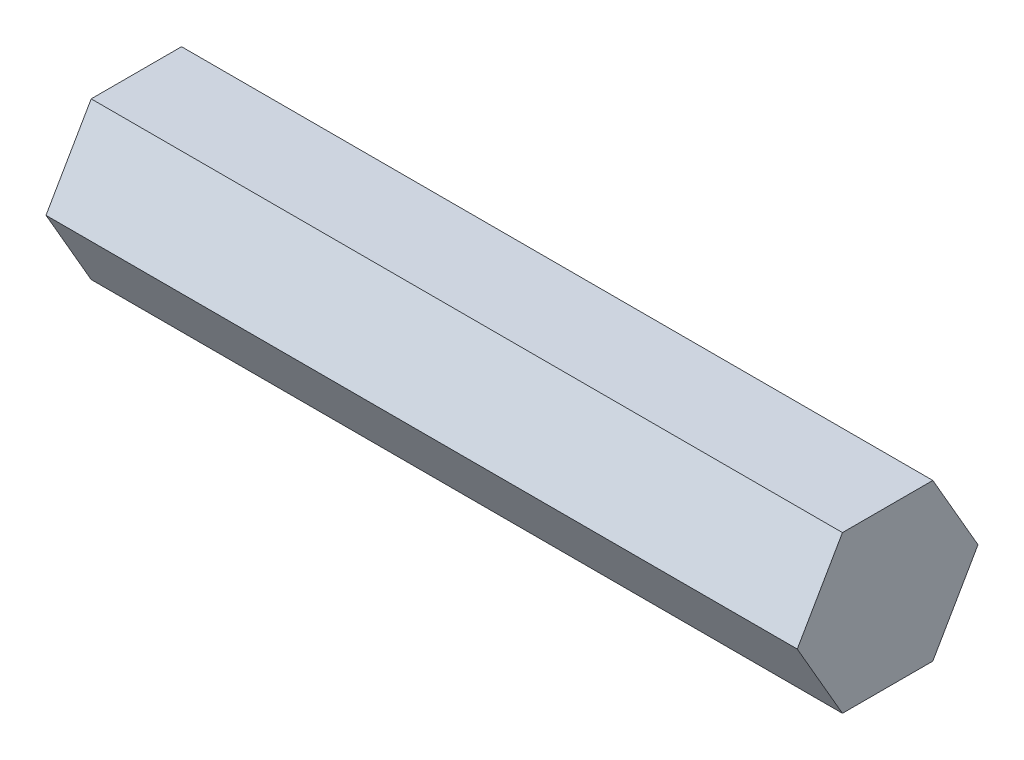
ISO-10303-21;
HEADER;
FILE_DESCRIPTION(('STEP AP214'),'2;1');
FILE_NAME('part.step','',(''),(''),'','','');
FILE_SCHEMA(('AUTOMOTIVE_DESIGN { 1 0 10303 214 1 1 1 1 }'));
ENDSEC;
DATA;
#1=APPLICATION_CONTEXT('core data for automotive mechanical design processes');
#2=APPLICATION_PROTOCOL_DEFINITION('international standard','automotive_design',2000,#1);
#3=PRODUCT_CONTEXT('',#1,'mechanical');
#4=PRODUCT('Part','Part','',(#3));
#5=PRODUCT_RELATED_PRODUCT_CATEGORY('part','',(#4));
#6=PRODUCT_DEFINITION_FORMATION('','',#4);
#7=PRODUCT_DEFINITION_CONTEXT('part definition',#1,'design');
#8=PRODUCT_DEFINITION('design','',#6,#7);
#9=PRODUCT_DEFINITION_SHAPE('','',#8);
#10=(LENGTH_UNIT() NAMED_UNIT(*) SI_UNIT(.MILLI.,.METRE.));
#11=(NAMED_UNIT(*) PLANE_ANGLE_UNIT() SI_UNIT($,.RADIAN.));
#12=(NAMED_UNIT(*) SI_UNIT($,.STERADIAN.) SOLID_ANGLE_UNIT());
#13=UNCERTAINTY_MEASURE_WITH_UNIT(LENGTH_MEASURE(1.E-05),#10,'distance_accuracy_value','');
#14=(GEOMETRIC_REPRESENTATION_CONTEXT(3) GLOBAL_UNCERTAINTY_ASSIGNED_CONTEXT((#13)) GLOBAL_UNIT_ASSIGNED_CONTEXT((#10,
#11,#12)) REPRESENTATION_CONTEXT('',''));
#15=CARTESIAN_POINT('',(0.,0.,0.));
#16=DIRECTION('',(0.,0.,1.));
#17=DIRECTION('',(1.,0.,0.));
#18=AXIS2_PLACEMENT_3D('',#15,#16,#17);
#19=CARTESIAN_POINT('',(60.96,-6.35,-3.66617420935412));
#20=DIRECTION('',(0.,0.5,0.866025403784439));
#21=DIRECTION('',(0.,-0.866025403784439,0.5));
#22=AXIS2_PLACEMENT_3D('',#19,#20,#21);
#23=PLANE('',#22);
#24=DIRECTION('',(0.,0.866025403784439,-0.5));
#25=VECTOR('',#24,1.);
#26=CARTESIAN_POINT('',(0.,-6.35,-3.66617420935412));
#27=LINE('',#26,#25);
#28=CARTESIAN_POINT('',(0.,-6.35,-3.66617420935412));
#29=VERTEX_POINT('',#28);
#30=CARTESIAN_POINT('',(0.,0.,-7.33234841870825));
#31=VERTEX_POINT('',#30);
#32=EDGE_CURVE('E119',#29,#31,#27,.T.);
#33=ORIENTED_EDGE('',*,*,#32,.T.);
#34=DIRECTION('',(-1.,0.,0.));
#35=VECTOR('',#34,1.);
#36=CARTESIAN_POINT('',(60.96,0.,-7.33234841870825));
#37=LINE('',#36,#35);
#38=CARTESIAN_POINT('',(60.96,0.,-7.33234841870825));
#39=VERTEX_POINT('',#38);
#40=EDGE_CURVE('E11',#39,#31,#37,.T.);
#41=ORIENTED_EDGE('',*,*,#40,.F.);
#42=DIRECTION('',(0.,0.866025403784439,-0.5));
#43=VECTOR('',#42,1.);
#44=CARTESIAN_POINT('',(60.96,-6.35,-3.66617420935412));
#45=LINE('',#44,#43);
#46=CARTESIAN_POINT('',(60.96,-6.35,-3.66617420935412));
#47=VERTEX_POINT('',#46);
#48=EDGE_CURVE('E129',#47,#39,#45,.T.);
#49=ORIENTED_EDGE('',*,*,#48,.F.);
#50=DIRECTION('',(-1.,0.,0.));
#51=VECTOR('',#50,1.);
#52=CARTESIAN_POINT('',(60.96,-6.35,-3.66617420935412));
#53=LINE('',#52,#51);
#54=EDGE_CURVE('E115',#47,#29,#53,.T.);
#55=ORIENTED_EDGE('',*,*,#54,.T.);
#56=EDGE_LOOP('',(#33,#41,#49,#55));
#57=FACE_BOUND('',#56,.T.);
#58=ADVANCED_FACE('F35',(#57),#23,.F.);
#59=CARTESIAN_POINT('',(60.96,0.,-7.33234841870825));
#60=DIRECTION('',(0.,-0.5,0.866025403784439));
#61=DIRECTION('',(0.,-0.866025403784439,-0.5));
#62=AXIS2_PLACEMENT_3D('',#59,#60,#61);
#63=PLANE('',#62);
#64=DIRECTION('',(0.,0.866025403784439,0.5));
#65=VECTOR('',#64,1.);
#66=CARTESIAN_POINT('',(0.,0.,-7.33234841870825));
#67=LINE('',#66,#65);
#68=CARTESIAN_POINT('',(0.,6.35,-3.66617420935412));
#69=VERTEX_POINT('',#68);
#70=EDGE_CURVE('E122',#31,#69,#67,.T.);
#71=ORIENTED_EDGE('',*,*,#70,.T.);
#72=DIRECTION('',(-1.,0.,0.));
#73=VECTOR('',#72,1.);
#74=CARTESIAN_POINT('',(60.96,6.35,-3.66617420935412));
#75=LINE('',#74,#73);
#76=CARTESIAN_POINT('',(60.96,6.35,-3.66617420935412));
#77=VERTEX_POINT('',#76);
#78=EDGE_CURVE('E43',#77,#69,#75,.T.);
#79=ORIENTED_EDGE('',*,*,#78,.F.);
#80=DIRECTION('',(0.,0.866025403784439,0.5));
#81=VECTOR('',#80,1.);
#82=CARTESIAN_POINT('',(60.96,0.,-7.33234841870825));
#83=LINE('',#82,#81);
#84=EDGE_CURVE('E88',#39,#77,#83,.T.);
#85=ORIENTED_EDGE('',*,*,#84,.F.);
#86=ORIENTED_EDGE('',*,*,#40,.T.);
#87=EDGE_LOOP('',(#71,#79,#85,#86));
#88=FACE_BOUND('',#87,.T.);
#89=ADVANCED_FACE('F153',(#88),#63,.F.);
#90=CARTESIAN_POINT('',(60.96,6.35,-3.66617420935412));
#91=DIRECTION('',(0.,-1.,0.));
#92=DIRECTION('',(0.,0.,-1.));
#93=AXIS2_PLACEMENT_3D('',#90,#91,#92);
#94=PLANE('',#93);
#95=DIRECTION('',(0.,0.,1.));
#96=VECTOR('',#95,1.);
#97=CARTESIAN_POINT('',(0.,6.35,-3.66617420935412));
#98=LINE('',#97,#96);
#99=CARTESIAN_POINT('',(0.,6.35,3.66617420935412));
#100=VERTEX_POINT('',#99);
#101=EDGE_CURVE('E124',#69,#100,#98,.T.);
#102=ORIENTED_EDGE('',*,*,#101,.T.);
#103=DIRECTION('',(-1.,0.,0.));
#104=VECTOR('',#103,1.);
#105=CARTESIAN_POINT('',(60.96,6.35,3.66617420935412));
#106=LINE('',#105,#104);
#107=CARTESIAN_POINT('',(60.96,6.35,3.66617420935412));
#108=VERTEX_POINT('',#107);
#109=EDGE_CURVE('E110',#108,#100,#106,.T.);
#110=ORIENTED_EDGE('',*,*,#109,.F.);
#111=DIRECTION('',(0.,0.,1.));
#112=VECTOR('',#111,1.);
#113=CARTESIAN_POINT('',(60.96,6.35,-3.66617420935412));
#114=LINE('',#113,#112);
#115=EDGE_CURVE('E101',#77,#108,#114,.T.);
#116=ORIENTED_EDGE('',*,*,#115,.F.);
#117=ORIENTED_EDGE('',*,*,#78,.T.);
#118=EDGE_LOOP('',(#102,#110,#116,#117));
#119=FACE_BOUND('',#118,.T.);
#120=ADVANCED_FACE('F135',(#119),#94,.F.);
#121=CARTESIAN_POINT('',(60.96,6.35,3.66617420935412));
#122=DIRECTION('',(0.,-0.5,-0.866025403784439));
#123=DIRECTION('',(0.,0.866025403784439,-0.5));
#124=AXIS2_PLACEMENT_3D('',#121,#122,#123);
#125=PLANE('',#124);
#126=DIRECTION('',(0.,-0.866025403784439,0.5));
#127=VECTOR('',#126,1.);
#128=CARTESIAN_POINT('',(0.,6.35,3.66617420935412));
#129=LINE('',#128,#127);
#130=CARTESIAN_POINT('',(0.,0.,7.33234841870825));
#131=VERTEX_POINT('',#130);
#132=EDGE_CURVE('E109',#100,#131,#129,.T.);
#133=ORIENTED_EDGE('',*,*,#132,.T.);
#134=DIRECTION('',(-1.,0.,0.));
#135=VECTOR('',#134,1.);
#136=CARTESIAN_POINT('',(60.96,0.,7.33234841870825));
#137=LINE('',#136,#135);
#138=CARTESIAN_POINT('',(60.96,0.,7.33234841870825));
#139=VERTEX_POINT('',#138);
#140=EDGE_CURVE('E106',#139,#131,#137,.T.);
#141=ORIENTED_EDGE('',*,*,#140,.F.);
#142=DIRECTION('',(0.,-0.866025403784439,0.5));
#143=VECTOR('',#142,1.);
#144=CARTESIAN_POINT('',(60.96,6.35,3.66617420935412));
#145=LINE('',#144,#143);
#146=EDGE_CURVE('E95',#108,#139,#145,.T.);
#147=ORIENTED_EDGE('',*,*,#146,.F.);
#148=ORIENTED_EDGE('',*,*,#109,.T.);
#149=EDGE_LOOP('',(#133,#141,#147,#148));
#150=FACE_BOUND('',#149,.T.);
#151=ADVANCED_FACE('F107',(#150),#125,.F.);
#152=CARTESIAN_POINT('',(60.96,0.,7.33234841870825));
#153=DIRECTION('',(0.,0.5,-0.866025403784439));
#154=DIRECTION('',(0.,0.866025403784439,0.5));
#155=AXIS2_PLACEMENT_3D('',#152,#153,#154);
#156=PLANE('',#155);
#157=DIRECTION('',(0.,-0.866025403784439,-0.5));
#158=VECTOR('',#157,1.);
#159=CARTESIAN_POINT('',(0.,0.,7.33234841870825));
#160=LINE('',#159,#158);
#161=CARTESIAN_POINT('',(0.,-6.35,3.66617420935413));
#162=VERTEX_POINT('',#161);
#163=EDGE_CURVE('E74',#131,#162,#160,.T.);
#164=ORIENTED_EDGE('',*,*,#163,.T.);
#165=DIRECTION('',(-1.,0.,0.));
#166=VECTOR('',#165,1.);
#167=CARTESIAN_POINT('',(60.96,-6.35,3.66617420935413));
#168=LINE('',#167,#166);
#169=CARTESIAN_POINT('',(60.96,-6.35,3.66617420935413));
#170=VERTEX_POINT('',#169);
#171=EDGE_CURVE('E111',#170,#162,#168,.T.);
#172=ORIENTED_EDGE('',*,*,#171,.F.);
#173=DIRECTION('',(0.,-0.866025403784439,-0.5));
#174=VECTOR('',#173,1.);
#175=CARTESIAN_POINT('',(60.96,0.,7.33234841870825));
#176=LINE('',#175,#174);
#177=EDGE_CURVE('E99',#139,#170,#176,.T.);
#178=ORIENTED_EDGE('',*,*,#177,.F.);
#179=ORIENTED_EDGE('',*,*,#140,.T.);
#180=EDGE_LOOP('',(#164,#172,#178,#179));
#181=FACE_BOUND('',#180,.T.);
#182=ADVANCED_FACE('F113',(#181),#156,.F.);
#183=CARTESIAN_POINT('',(60.96,-6.35,3.66617420935413));
#184=DIRECTION('',(0.,1.,0.));
#185=DIRECTION('',(0.,0.,1.));
#186=AXIS2_PLACEMENT_3D('',#183,#184,#185);
#187=PLANE('',#186);
#188=DIRECTION('',(0.,0.,-1.));
#189=VECTOR('',#188,1.);
#190=CARTESIAN_POINT('',(0.,-6.35,3.66617420935413));
#191=LINE('',#190,#189);
#192=EDGE_CURVE('E80',#162,#29,#191,.T.);
#193=ORIENTED_EDGE('',*,*,#192,.T.);
#194=ORIENTED_EDGE('',*,*,#54,.F.);
#195=DIRECTION('',(0.,0.,-1.));
#196=VECTOR('',#195,1.);
#197=CARTESIAN_POINT('',(60.96,-6.35,3.66617420935413));
#198=LINE('',#197,#196);
#199=EDGE_CURVE('E51',#170,#47,#198,.T.);
#200=ORIENTED_EDGE('',*,*,#199,.F.);
#201=ORIENTED_EDGE('',*,*,#171,.T.);
#202=EDGE_LOOP('',(#193,#194,#200,#201));
#203=FACE_BOUND('',#202,.T.);
#204=ADVANCED_FACE('F142',(#203),#187,.F.);
#205=CARTESIAN_POINT('',(60.96,0.,0.));
#206=DIRECTION('',(1.,0.,0.));
#207=DIRECTION('',(0.,0.,-1.));
#208=AXIS2_PLACEMENT_3D('',#205,#206,#207);
#209=PLANE('',#208);
#210=ORIENTED_EDGE('',*,*,#48,.T.);
#211=ORIENTED_EDGE('',*,*,#84,.T.);
#212=ORIENTED_EDGE('',*,*,#115,.T.);
#213=ORIENTED_EDGE('',*,*,#146,.T.);
#214=ORIENTED_EDGE('',*,*,#177,.T.);
#215=ORIENTED_EDGE('',*,*,#199,.T.);
#216=EDGE_LOOP('',(#210,#211,#212,#213,#214,#215));
#217=FACE_BOUND('',#216,.T.);
#218=ADVANCED_FACE('F97',(#217),#209,.T.);
#219=CARTESIAN_POINT('',(0.,0.,0.));
#220=DIRECTION('',(1.,0.,0.));
#221=DIRECTION('',(0.,0.,-1.));
#222=AXIS2_PLACEMENT_3D('',#219,#220,#221);
#223=PLANE('',#222);
#224=ORIENTED_EDGE('',*,*,#32,.F.);
#225=ORIENTED_EDGE('',*,*,#192,.F.);
#226=ORIENTED_EDGE('',*,*,#163,.F.);
#227=ORIENTED_EDGE('',*,*,#132,.F.);
#228=ORIENTED_EDGE('',*,*,#101,.F.);
#229=ORIENTED_EDGE('',*,*,#70,.F.);
#230=EDGE_LOOP('',(#224,#225,#226,#227,#228,#229));
#231=FACE_BOUND('',#230,.T.);
#232=ADVANCED_FACE('F138',(#231),#223,.F.);
#233=CLOSED_SHELL('',(#58,#89,#120,#151,#182,#204,#218,#232));
#234=MANIFOLD_SOLID_BREP('B2',#233);
#235=ADVANCED_BREP_SHAPE_REPRESENTATION('',(#18,#234),#14);
#236=SHAPE_DEFINITION_REPRESENTATION(#9,#235);
ENDSEC;
END-ISO-10303-21;
